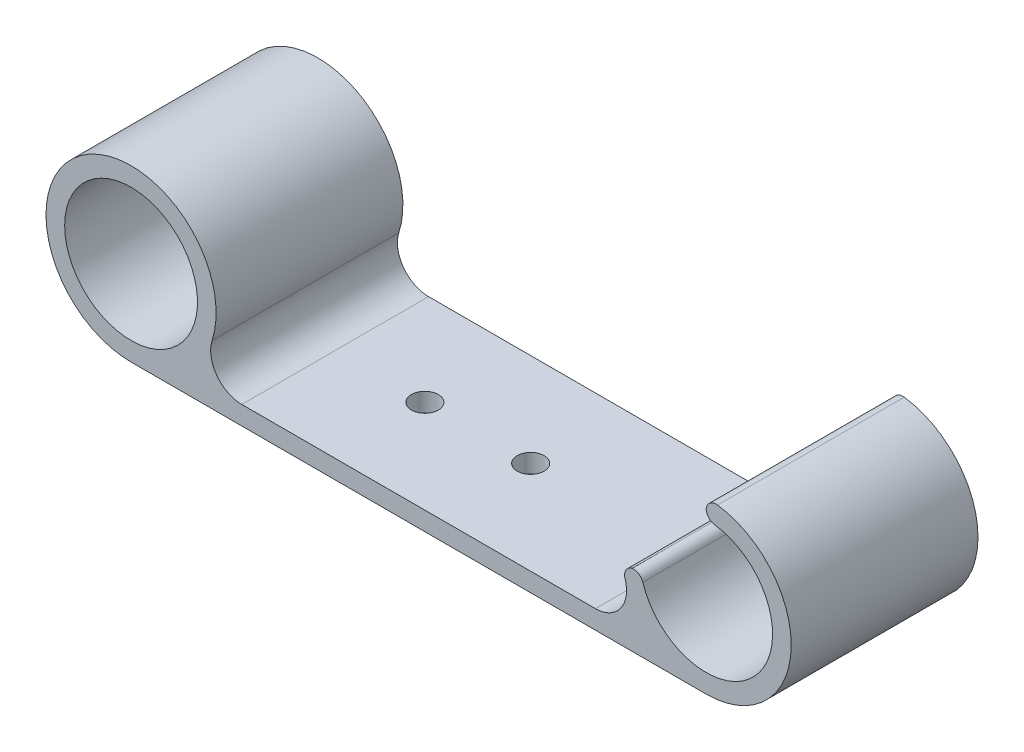
ISO-10303-21;
HEADER;
FILE_DESCRIPTION(('STEP AP214'),'2;1');
FILE_NAME('part.step','',(''),(''),'','','');
FILE_SCHEMA(('AUTOMOTIVE_DESIGN { 1 0 10303 214 1 1 1 1 }'));
ENDSEC;
DATA;
#1=APPLICATION_CONTEXT('core data for automotive mechanical design processes');
#2=APPLICATION_PROTOCOL_DEFINITION('international standard','automotive_design',2000,#1);
#3=PRODUCT_CONTEXT('',#1,'mechanical');
#4=PRODUCT('Part','Part','',(#3));
#5=PRODUCT_RELATED_PRODUCT_CATEGORY('part','',(#4));
#6=PRODUCT_DEFINITION_FORMATION('','',#4);
#7=PRODUCT_DEFINITION_CONTEXT('part definition',#1,'design');
#8=PRODUCT_DEFINITION('design','',#6,#7);
#9=PRODUCT_DEFINITION_SHAPE('','',#8);
#10=(LENGTH_UNIT() NAMED_UNIT(*) SI_UNIT(.MILLI.,.METRE.));
#11=(NAMED_UNIT(*) PLANE_ANGLE_UNIT() SI_UNIT($,.RADIAN.));
#12=(NAMED_UNIT(*) SI_UNIT($,.STERADIAN.) SOLID_ANGLE_UNIT());
#13=UNCERTAINTY_MEASURE_WITH_UNIT(LENGTH_MEASURE(1.E-05),#10,'distance_accuracy_value','');
#14=(GEOMETRIC_REPRESENTATION_CONTEXT(3) GLOBAL_UNCERTAINTY_ASSIGNED_CONTEXT((#13)) GLOBAL_UNIT_ASSIGNED_CONTEXT((#10,
#11,#12)) REPRESENTATION_CONTEXT('',''));
#15=CARTESIAN_POINT('',(0.,0.,0.));
#16=DIRECTION('',(0.,0.,1.));
#17=DIRECTION('',(1.,0.,0.));
#18=AXIS2_PLACEMENT_3D('',#15,#16,#17);
#19=CARTESIAN_POINT('',(58.658787305,17.3553125,19.05));
#20=DIRECTION('',(0.,0.,-1.));
#21=DIRECTION('',(-1.,0.,0.));
#22=AXIS2_PLACEMENT_3D('',#19,#20,#21);
#23=CYLINDRICAL_SURFACE('',#22,17.3553125);
#24=CARTESIAN_POINT('',(58.658787305,17.3553125,-19.05));
#25=DIRECTION('',(0.,0.,1.));
#26=DIRECTION('',(1.,0.,0.));
#27=AXIS2_PLACEMENT_3D('',#24,#25,#26);
#28=CIRCLE('',#27,17.3553125);
#29=CARTESIAN_POINT('',(60.9602475799895,34.5573516981678,-19.05));
#30=VERTEX_POINT('',#29);
#31=CARTESIAN_POINT('',(58.658787305,0.,-19.05));
#32=VERTEX_POINT('',#31);
#33=EDGE_CURVE('E264',#30,#32,#28,.F.);
#34=ORIENTED_EDGE('',*,*,#33,.F.);
#35=DIRECTION('',(0.,0.,-1.));
#36=VECTOR('',#35,1.);
#37=CARTESIAN_POINT('',(60.9602475799895,34.5573516981678,19.05));
#38=LINE('',#37,#36);
#39=CARTESIAN_POINT('',(60.9602475799895,34.5573516981678,19.05));
#40=VERTEX_POINT('',#39);
#41=EDGE_CURVE('E192',#30,#40,#38,.F.);
#42=ORIENTED_EDGE('',*,*,#41,.T.);
#43=CARTESIAN_POINT('',(58.658787305,17.3553125,19.05));
#44=DIRECTION('',(0.,0.,1.));
#45=DIRECTION('',(1.,0.,0.));
#46=AXIS2_PLACEMENT_3D('',#43,#44,#45);
#47=CIRCLE('',#46,17.3553125);
#48=CARTESIAN_POINT('',(58.658787305,0.,19.05));
#49=VERTEX_POINT('',#48);
#50=EDGE_CURVE('E160',#40,#49,#47,.F.);
#51=ORIENTED_EDGE('',*,*,#50,.T.);
#52=DIRECTION('',(0.,0.,-1.));
#53=VECTOR('',#52,1.);
#54=CARTESIAN_POINT('',(58.658787305,0.,19.05));
#55=LINE('',#54,#53);
#56=EDGE_CURVE('E144',#49,#32,#55,.T.);
#57=ORIENTED_EDGE('',*,*,#56,.T.);
#58=EDGE_LOOP('',(#34,#42,#51,#57));
#59=FACE_BOUND('',#58,.T.);
#60=ADVANCED_FACE('F45',(#59),#23,.T.);
#61=CARTESIAN_POINT('',(58.658787305,17.3553125,19.05));
#62=DIRECTION('',(0.,0.,-1.));
#63=DIRECTION('',(-1.,0.,0.));
#64=AXIS2_PLACEMENT_3D('',#61,#62,#63);
#65=CYLINDRICAL_SURFACE('',#64,13.5453125);
#66=CARTESIAN_POINT('',(58.658787305,17.3553125,19.05));
#67=DIRECTION('',(0.,0.,1.));
#68=DIRECTION('',(1.,0.,0.));
#69=AXIS2_PLACEMENT_3D('',#66,#67,#68);
#70=CIRCLE('',#69,13.5453125);
#71=CARTESIAN_POINT('',(45.7400642600769,13.2832017928568,19.05));
#72=VERTEX_POINT('',#71);
#73=CARTESIAN_POINT('',(60.425720785984,30.7848857172111,19.05));
#74=VERTEX_POINT('',#73);
#75=EDGE_CURVE('E244',#72,#74,#70,.T.);
#76=ORIENTED_EDGE('',*,*,#75,.T.);
#77=DIRECTION('',(0.,0.,-1.));
#78=VECTOR('',#77,1.);
#79=CARTESIAN_POINT('',(60.425720785984,30.7848857172111,19.05));
#80=LINE('',#79,#78);
#81=CARTESIAN_POINT('',(60.425720785984,30.7848857172111,-19.05));
#82=VERTEX_POINT('',#81);
#83=EDGE_CURVE('E55',#74,#82,#80,.T.);
#84=ORIENTED_EDGE('',*,*,#83,.T.);
#85=CARTESIAN_POINT('',(58.658787305,17.3553125,-19.05));
#86=DIRECTION('',(0.,0.,1.));
#87=DIRECTION('',(1.,0.,0.));
#88=AXIS2_PLACEMENT_3D('',#85,#86,#87);
#89=CIRCLE('',#88,13.5453125);
#90=CARTESIAN_POINT('',(45.7400642600769,13.2832017928568,-19.05));
#91=VERTEX_POINT('',#90);
#92=EDGE_CURVE('E267',#91,#82,#89,.T.);
#93=ORIENTED_EDGE('',*,*,#92,.F.);
#94=DIRECTION('',(0.,0.,-1.));
#95=VECTOR('',#94,1.);
#96=CARTESIAN_POINT('',(45.7400642600769,13.2832017928568,19.05));
#97=LINE('',#96,#95);
#98=EDGE_CURVE('E206',#91,#72,#97,.F.);
#99=ORIENTED_EDGE('',*,*,#98,.T.);
#100=EDGE_LOOP('',(#76,#84,#93,#99));
#101=FACE_BOUND('',#100,.T.);
#102=ADVANCED_FACE('F316',(#101),#65,.F.);
#103=CARTESIAN_POINT('',(58.658787305,17.3553125,19.05));
#104=DIRECTION('',(0.,0.,-1.));
#105=DIRECTION('',(-1.,0.,0.));
#106=AXIS2_PLACEMENT_3D('',#103,#104,#105);
#107=CYLINDRICAL_SURFACE('',#106,17.3553125);
#108=CARTESIAN_POINT('',(58.658787305,17.3553125,19.05));
#109=DIRECTION('',(0.,0.,1.));
#110=DIRECTION('',(1.,0.,0.));
#111=AXIS2_PLACEMENT_3D('',#108,#109,#110);
#112=CIRCLE('',#111,17.3553125);
#113=CARTESIAN_POINT('',(42.1222748785896,12.0874259461882,19.05));
#114=VERTEX_POINT('',#113);
#115=CARTESIAN_POINT('',(42.1177301177492,12.1017138190237,19.05));
#116=VERTEX_POINT('',#115);
#117=EDGE_CURVE('E248',#114,#116,#112,.F.);
#118=ORIENTED_EDGE('',*,*,#117,.T.);
#119=DIRECTION('',(0.,0.,-1.));
#120=VECTOR('',#119,1.);
#121=CARTESIAN_POINT('',(42.1177301177492,12.1017138190237,19.05));
#122=LINE('',#121,#120);
#123=CARTESIAN_POINT('',(42.1177301177492,12.1017138190237,-19.05));
#124=VERTEX_POINT('',#123);
#125=EDGE_CURVE('E11',#116,#124,#122,.T.);
#126=ORIENTED_EDGE('',*,*,#125,.T.);
#127=CARTESIAN_POINT('',(58.658787305,17.3553125,-19.05));
#128=DIRECTION('',(0.,0.,1.));
#129=DIRECTION('',(1.,0.,0.));
#130=AXIS2_PLACEMENT_3D('',#127,#128,#129);
#131=CIRCLE('',#130,17.3553125);
#132=CARTESIAN_POINT('',(42.1222748785896,12.0874259461882,-19.05));
#133=VERTEX_POINT('',#132);
#134=EDGE_CURVE('E271',#133,#124,#131,.F.);
#135=ORIENTED_EDGE('',*,*,#134,.F.);
#136=DIRECTION('',(0.,0.,-1.));
#137=VECTOR('',#136,1.);
#138=CARTESIAN_POINT('',(42.1222748785896,12.0874259461882,19.05));
#139=LINE('',#138,#137);
#140=EDGE_CURVE('E171',#114,#133,#139,.T.);
#141=ORIENTED_EDGE('',*,*,#140,.F.);
#142=EDGE_LOOP('',(#118,#126,#135,#141));
#143=FACE_BOUND('',#142,.T.);
#144=ADVANCED_FACE('F299',(#143),#107,.T.);
#145=CARTESIAN_POINT('',(36.0718592546874,10.16,19.05));
#146=DIRECTION('',(0.,0.,-1.));
#147=DIRECTION('',(-1.,0.,0.));
#148=AXIS2_PLACEMENT_3D('',#145,#146,#147);
#149=CYLINDRICAL_SURFACE('',#148,6.35);
#150=CARTESIAN_POINT('',(36.0718592546874,10.16,-19.05));
#151=DIRECTION('',(0.,0.,1.));
#152=DIRECTION('',(1.,0.,0.));
#153=AXIS2_PLACEMENT_3D('',#150,#151,#152);
#154=CIRCLE('',#153,6.35);
#155=CARTESIAN_POINT('',(36.0718592546874,3.81,-19.05));
#156=VERTEX_POINT('',#155);
#157=EDGE_CURVE('E275',#156,#133,#154,.T.);
#158=ORIENTED_EDGE('',*,*,#157,.F.);
#159=DIRECTION('',(0.,0.,-1.));
#160=VECTOR('',#159,1.);
#161=CARTESIAN_POINT('',(36.0718592546874,3.81,19.05));
#162=LINE('',#161,#160);
#163=CARTESIAN_POINT('',(36.0718592546874,3.81,19.05));
#164=VERTEX_POINT('',#163);
#165=EDGE_CURVE('E287',#164,#156,#162,.T.);
#166=ORIENTED_EDGE('',*,*,#165,.F.);
#167=CARTESIAN_POINT('',(36.0718592546874,10.16,19.05));
#168=DIRECTION('',(0.,0.,1.));
#169=DIRECTION('',(1.,0.,0.));
#170=AXIS2_PLACEMENT_3D('',#167,#168,#169);
#171=CIRCLE('',#170,6.35);
#172=EDGE_CURVE('E252',#164,#114,#171,.T.);
#173=ORIENTED_EDGE('',*,*,#172,.T.);
#174=ORIENTED_EDGE('',*,*,#140,.T.);
#175=EDGE_LOOP('',(#158,#166,#173,#174));
#176=FACE_BOUND('',#175,.T.);
#177=ADVANCED_FACE('F294',(#176),#149,.F.);
#178=CARTESIAN_POINT('',(0.,3.81,0.));
#179=DIRECTION('',(0.,-1.,0.));
#180=DIRECTION('',(0.,0.,-1.));
#181=AXIS2_PLACEMENT_3D('',#178,#179,#180);
#182=PLANE('',#181);
#183=CARTESIAN_POINT('',(-17.78,3.81,0.));
#184=DIRECTION('',(0.,1.,0.));
#185=DIRECTION('',(0.,0.,1.));
#186=AXIS2_PLACEMENT_3D('',#183,#184,#185);
#187=CIRCLE('',#186,2.749999961);
#188=CARTESIAN_POINT('',(-17.78,3.81,2.749999961));
#189=VERTEX_POINT('',#188);
#190=EDGE_CURVE('E223',#189,#189,#187,.T.);
#191=ORIENTED_EDGE('',*,*,#190,.F.);
#192=EDGE_LOOP('',(#191));
#193=FACE_BOUND('',#192,.T.);
#194=CARTESIAN_POINT('',(3.81,3.81,0.));
#195=DIRECTION('',(0.,1.,0.));
#196=DIRECTION('',(0.,0.,1.));
#197=AXIS2_PLACEMENT_3D('',#194,#195,#196);
#198=CIRCLE('',#197,2.749999961);
#199=CARTESIAN_POINT('',(3.81,3.81,2.749999961));
#200=VERTEX_POINT('',#199);
#201=EDGE_CURVE('E230',#200,#200,#198,.T.);
#202=ORIENTED_EDGE('',*,*,#201,.F.);
#203=EDGE_LOOP('',(#202));
#204=FACE_BOUND('',#203,.T.);
#205=ORIENTED_EDGE('',*,*,#165,.T.);
#206=DIRECTION('',(-1.,0.,0.));
#207=VECTOR('',#206,1.);
#208=CARTESIAN_POINT('',(-57.15,3.81,-19.05));
#209=LINE('',#208,#207);
#210=CARTESIAN_POINT('',(-36.0718592546874,3.81,-19.05));
#211=VERTEX_POINT('',#210);
#212=EDGE_CURVE('E146',#156,#211,#209,.T.);
#213=ORIENTED_EDGE('',*,*,#212,.T.);
#214=DIRECTION('',(0.,0.,-1.));
#215=VECTOR('',#214,1.);
#216=CARTESIAN_POINT('',(-36.0718592546874,3.81,19.05));
#217=LINE('',#216,#215);
#218=CARTESIAN_POINT('',(-36.0718592546874,3.81,19.05));
#219=VERTEX_POINT('',#218);
#220=EDGE_CURVE('E283',#219,#211,#217,.T.);
#221=ORIENTED_EDGE('',*,*,#220,.F.);
#222=DIRECTION('',(1.,0.,0.));
#223=VECTOR('',#222,1.);
#224=CARTESIAN_POINT('',(-57.15,3.81,19.05));
#225=LINE('',#224,#223);
#226=EDGE_CURVE('E177',#219,#164,#225,.T.);
#227=ORIENTED_EDGE('',*,*,#226,.T.);
#228=EDGE_LOOP('',(#205,#213,#221,#227));
#229=FACE_BOUND('',#228,.T.);
#230=ADVANCED_FACE('F307',(#193,#204,#229),#182,.F.);
#231=CARTESIAN_POINT('',(-57.15,3.81,-19.05));
#232=DIRECTION('',(0.,0.,1.));
#233=DIRECTION('',(1.,0.,0.));
#234=AXIS2_PLACEMENT_3D('',#231,#232,#233);
#235=PLANE('',#234);
#236=CARTESIAN_POINT('',(60.690787305,32.7995230891708,-19.05));
#237=DIRECTION('',(0.,0.,1.));
#238=DIRECTION('',(1.,0.,0.));
#239=AXIS2_PLACEMENT_3D('',#236,#237,#238);
#240=CIRCLE('',#239,2.032);
#241=CARTESIAN_POINT('',(58.6628299373703,32.6714101894436,-19.05));
#242=VERTEX_POINT('',#241);
#243=EDGE_CURVE('E186',#82,#242,#240,.F.);
#244=ORIENTED_EDGE('',*,*,#243,.T.);
#245=CARTESIAN_POINT('',(60.690787305,32.5432972897164,-19.05));
#246=DIRECTION('',(0.,0.,1.));
#247=DIRECTION('',(1.,0.,0.));
#248=AXIS2_PLACEMENT_3D('',#245,#246,#247);
#249=CIRCLE('',#248,2.032);
#250=EDGE_CURVE('E189',#242,#30,#249,.F.);
#251=ORIENTED_EDGE('',*,*,#250,.T.);
#252=ORIENTED_EDGE('',*,*,#33,.T.);
#253=DIRECTION('',(-1.,0.,0.));
#254=VECTOR('',#253,1.);
#255=CARTESIAN_POINT('',(-57.15,0.,-19.05));
#256=LINE('',#255,#254);
#257=CARTESIAN_POINT('',(-58.658787305,0.,-19.05));
#258=VERTEX_POINT('',#257);
#259=EDGE_CURVE('E147',#32,#258,#256,.T.);
#260=ORIENTED_EDGE('',*,*,#259,.T.);
#261=CARTESIAN_POINT('',(-58.658787305,17.3553125,-19.05));
#262=DIRECTION('',(0.,0.,1.));
#263=DIRECTION('',(1.,0.,0.));
#264=AXIS2_PLACEMENT_3D('',#261,#262,#263);
#265=CIRCLE('',#264,17.3553125);
#266=CARTESIAN_POINT('',(-42.1222748785896,12.0874259461882,-19.05));
#267=VERTEX_POINT('',#266);
#268=EDGE_CURVE('E165',#267,#258,#265,.T.);
#269=ORIENTED_EDGE('',*,*,#268,.F.);
#270=CARTESIAN_POINT('',(-36.0718592546874,10.16,-19.05));
#271=DIRECTION('',(0.,0.,1.));
#272=DIRECTION('',(1.,0.,0.));
#273=AXIS2_PLACEMENT_3D('',#270,#271,#272);
#274=CIRCLE('',#273,6.35);
#275=EDGE_CURVE('E240',#211,#267,#274,.F.);
#276=ORIENTED_EDGE('',*,*,#275,.F.);
#277=ORIENTED_EDGE('',*,*,#212,.F.);
#278=ORIENTED_EDGE('',*,*,#157,.T.);
#279=ORIENTED_EDGE('',*,*,#134,.T.);
#280=CARTESIAN_POINT('',(44.054395228475,12.7168172647118,-19.05));
#281=DIRECTION('',(0.,0.,1.));
#282=DIRECTION('',(1.,0.,0.));
#283=AXIS2_PLACEMENT_3D('',#280,#281,#282);
#284=CIRCLE('',#283,2.032);
#285=CARTESIAN_POINT('',(43.5760775502877,14.6917188315585,-19.05));
#286=VERTEX_POINT('',#285);
#287=EDGE_CURVE('E179',#124,#286,#284,.F.);
#288=ORIENTED_EDGE('',*,*,#287,.T.);
#289=CARTESIAN_POINT('',(43.8020620746505,12.6723241215653,-19.05));
#290=DIRECTION('',(0.,0.,1.));
#291=DIRECTION('',(1.,0.,0.));
#292=AXIS2_PLACEMENT_3D('',#289,#290,#291);
#293=CIRCLE('',#292,2.032);
#294=EDGE_CURVE('E183',#286,#91,#293,.F.);
#295=ORIENTED_EDGE('',*,*,#294,.T.);
#296=ORIENTED_EDGE('',*,*,#92,.T.);
#297=EDGE_LOOP('',(#244,#251,#252,#260,#269,#276,#277,#278,#279,#288,#295,#296));
#298=FACE_BOUND('',#297,.T.);
#299=CARTESIAN_POINT('',(-58.658787305,17.3553125,-19.05));
#300=DIRECTION('',(0.,0.,1.));
#301=DIRECTION('',(1.,0.,0.));
#302=AXIS2_PLACEMENT_3D('',#299,#300,#301);
#303=CIRCLE('',#302,13.5453125);
#304=CARTESIAN_POINT('',(-72.204099805,17.3553125,-19.05));
#305=VERTEX_POINT('',#304);
#306=EDGE_CURVE('E216',#305,#305,#303,.T.);
#307=ORIENTED_EDGE('',*,*,#306,.T.);
#308=EDGE_LOOP('',(#307));
#309=FACE_BOUND('',#308,.T.);
#310=ADVANCED_FACE('F303',(#298,#309),#235,.F.);
#311=CARTESIAN_POINT('',(-57.15,3.81,19.05));
#312=DIRECTION('',(0.,0.,-1.));
#313=DIRECTION('',(-1.,0.,0.));
#314=AXIS2_PLACEMENT_3D('',#311,#312,#313);
#315=PLANE('',#314);
#316=ORIENTED_EDGE('',*,*,#50,.F.);
#317=CARTESIAN_POINT('',(60.690787305,32.5432972897164,19.05));
#318=DIRECTION('',(0.,0.,-1.));
#319=DIRECTION('',(-1.,0.,0.));
#320=AXIS2_PLACEMENT_3D('',#317,#318,#319);
#321=CIRCLE('',#320,2.032);
#322=CARTESIAN_POINT('',(58.6628299373703,32.6714101894436,19.05));
#323=VERTEX_POINT('',#322);
#324=EDGE_CURVE('E63',#40,#323,#321,.F.);
#325=ORIENTED_EDGE('',*,*,#324,.T.);
#326=CARTESIAN_POINT('',(60.690787305,32.7995230891708,19.05));
#327=DIRECTION('',(0.,0.,-1.));
#328=DIRECTION('',(-1.,0.,0.));
#329=AXIS2_PLACEMENT_3D('',#326,#327,#328);
#330=CIRCLE('',#329,2.032);
#331=EDGE_CURVE('E201',#323,#74,#330,.F.);
#332=ORIENTED_EDGE('',*,*,#331,.T.);
#333=ORIENTED_EDGE('',*,*,#75,.F.);
#334=CARTESIAN_POINT('',(43.8020620746505,12.6723241215653,19.05));
#335=DIRECTION('',(0.,0.,-1.));
#336=DIRECTION('',(-1.,0.,0.));
#337=AXIS2_PLACEMENT_3D('',#334,#335,#336);
#338=CIRCLE('',#337,2.032);
#339=CARTESIAN_POINT('',(43.5760775502877,14.6917188315585,19.05));
#340=VERTEX_POINT('',#339);
#341=EDGE_CURVE('E70',#72,#340,#338,.F.);
#342=ORIENTED_EDGE('',*,*,#341,.T.);
#343=CARTESIAN_POINT('',(44.054395228475,12.7168172647118,19.05));
#344=DIRECTION('',(0.,0.,-1.));
#345=DIRECTION('',(-1.,0.,0.));
#346=AXIS2_PLACEMENT_3D('',#343,#344,#345);
#347=CIRCLE('',#346,2.032);
#348=EDGE_CURVE('E196',#340,#116,#347,.F.);
#349=ORIENTED_EDGE('',*,*,#348,.T.);
#350=ORIENTED_EDGE('',*,*,#117,.F.);
#351=ORIENTED_EDGE('',*,*,#172,.F.);
#352=ORIENTED_EDGE('',*,*,#226,.F.);
#353=CARTESIAN_POINT('',(-36.0718592546874,10.16,19.05));
#354=DIRECTION('',(0.,0.,1.));
#355=DIRECTION('',(1.,0.,0.));
#356=AXIS2_PLACEMENT_3D('',#353,#354,#355);
#357=CIRCLE('',#356,6.35);
#358=CARTESIAN_POINT('',(-42.1222748785896,12.0874259461882,19.05));
#359=VERTEX_POINT('',#358);
#360=EDGE_CURVE('E155',#219,#359,#357,.F.);
#361=ORIENTED_EDGE('',*,*,#360,.T.);
#362=CARTESIAN_POINT('',(-58.658787305,17.3553125,19.05));
#363=DIRECTION('',(0.,0.,1.));
#364=DIRECTION('',(1.,0.,0.));
#365=AXIS2_PLACEMENT_3D('',#362,#363,#364);
#366=CIRCLE('',#365,17.3553125);
#367=CARTESIAN_POINT('',(-58.658787305,0.,19.05));
#368=VERTEX_POINT('',#367);
#369=EDGE_CURVE('E150',#359,#368,#366,.T.);
#370=ORIENTED_EDGE('',*,*,#369,.T.);
#371=DIRECTION('',(1.,0.,0.));
#372=VECTOR('',#371,1.);
#373=CARTESIAN_POINT('',(-57.15,0.,19.05));
#374=LINE('',#373,#372);
#375=EDGE_CURVE('E136',#368,#49,#374,.T.);
#376=ORIENTED_EDGE('',*,*,#375,.T.);
#377=EDGE_LOOP('',(#316,#325,#332,#333,#342,#349,#350,#351,#352,#361,#370,#376));
#378=FACE_BOUND('',#377,.T.);
#379=CARTESIAN_POINT('',(-58.658787305,17.3553125,19.05));
#380=DIRECTION('',(0.,0.,1.));
#381=DIRECTION('',(1.,0.,0.));
#382=AXIS2_PLACEMENT_3D('',#379,#380,#381);
#383=CIRCLE('',#382,13.5453125);
#384=CARTESIAN_POINT('',(-72.204099805,17.3553125,19.05));
#385=VERTEX_POINT('',#384);
#386=EDGE_CURVE('E161',#385,#385,#383,.T.);
#387=ORIENTED_EDGE('',*,*,#386,.F.);
#388=EDGE_LOOP('',(#387));
#389=FACE_BOUND('',#388,.T.);
#390=ADVANCED_FACE('F151',(#378,#389),#315,.F.);
#391=CARTESIAN_POINT('',(0.,0.,0.));
#392=DIRECTION('',(0.,-1.,0.));
#393=DIRECTION('',(0.,0.,-1.));
#394=AXIS2_PLACEMENT_3D('',#391,#392,#393);
#395=PLANE('',#394);
#396=CARTESIAN_POINT('',(-17.78,0.,0.));
#397=DIRECTION('',(0.,-1.,0.));
#398=DIRECTION('',(0.,0.,-1.));
#399=AXIS2_PLACEMENT_3D('',#396,#397,#398);
#400=CIRCLE('',#399,2.749999961);
#401=CARTESIAN_POINT('',(-17.78,0.,2.749999961));
#402=VERTEX_POINT('',#401);
#403=EDGE_CURVE('E49',#402,#402,#400,.T.);
#404=ORIENTED_EDGE('',*,*,#403,.F.);
#405=EDGE_LOOP('',(#404));
#406=FACE_BOUND('',#405,.T.);
#407=CARTESIAN_POINT('',(3.81,0.,0.));
#408=DIRECTION('',(0.,-1.,0.));
#409=DIRECTION('',(0.,0.,-1.));
#410=AXIS2_PLACEMENT_3D('',#407,#408,#409);
#411=CIRCLE('',#410,2.749999961);
#412=CARTESIAN_POINT('',(3.81,0.,2.749999961));
#413=VERTEX_POINT('',#412);
#414=EDGE_CURVE('E220',#413,#413,#411,.T.);
#415=ORIENTED_EDGE('',*,*,#414,.F.);
#416=EDGE_LOOP('',(#415));
#417=FACE_BOUND('',#416,.T.);
#418=ORIENTED_EDGE('',*,*,#259,.F.);
#419=ORIENTED_EDGE('',*,*,#56,.F.);
#420=ORIENTED_EDGE('',*,*,#375,.F.);
#421=DIRECTION('',(0.,0.,-1.));
#422=VECTOR('',#421,1.);
#423=CARTESIAN_POINT('',(-58.658787305,0.,19.05));
#424=LINE('',#423,#422);
#425=EDGE_CURVE('E141',#368,#258,#424,.T.);
#426=ORIENTED_EDGE('',*,*,#425,.T.);
#427=EDGE_LOOP('',(#418,#419,#420,#426));
#428=FACE_BOUND('',#427,.T.);
#429=ADVANCED_FACE('F139',(#406,#417,#428),#395,.T.);
#430=CARTESIAN_POINT('',(-58.658787305,17.3553125,19.05));
#431=DIRECTION('',(0.,0.,-1.));
#432=DIRECTION('',(-1.,0.,0.));
#433=AXIS2_PLACEMENT_3D('',#430,#431,#432);
#434=CYLINDRICAL_SURFACE('',#433,17.3553125);
#435=ORIENTED_EDGE('',*,*,#268,.T.);
#436=ORIENTED_EDGE('',*,*,#425,.F.);
#437=ORIENTED_EDGE('',*,*,#369,.F.);
#438=DIRECTION('',(0.,0.,-1.));
#439=VECTOR('',#438,1.);
#440=CARTESIAN_POINT('',(-42.1222748785896,12.0874259461882,19.05));
#441=LINE('',#440,#439);
#442=EDGE_CURVE('E258',#359,#267,#441,.T.);
#443=ORIENTED_EDGE('',*,*,#442,.T.);
#444=EDGE_LOOP('',(#435,#436,#437,#443));
#445=FACE_BOUND('',#444,.T.);
#446=ADVANCED_FACE('F163',(#445),#434,.T.);
#447=CARTESIAN_POINT('',(-58.658787305,17.3553125,19.05));
#448=DIRECTION('',(0.,0.,-1.));
#449=DIRECTION('',(-1.,0.,0.));
#450=AXIS2_PLACEMENT_3D('',#447,#448,#449);
#451=CYLINDRICAL_SURFACE('',#450,13.5453125);
#452=CARTESIAN_POINT('',(-72.204099805,17.3553125,19.05));
#453=CARTESIAN_POINT('',(-72.204099805,17.3553125,18.653125));
#454=CARTESIAN_POINT('',(-72.204099805,17.3553125,18.25625));
#455=CARTESIAN_POINT('',(-72.204099805,17.3553125,17.4625));
#456=CARTESIAN_POINT('',(-72.204099805,17.3553125,17.065625));
#457=CARTESIAN_POINT('',(-72.204099805,17.3553125,16.271875));
#458=CARTESIAN_POINT('',(-72.204099805,17.3553125,15.875));
#459=CARTESIAN_POINT('',(-72.204099805,17.3553125,15.08125));
#460=CARTESIAN_POINT('',(-72.204099805,17.3553125,14.684375));
#461=CARTESIAN_POINT('',(-72.204099805,17.3553125,13.890625));
#462=CARTESIAN_POINT('',(-72.204099805,17.3553125,13.49375));
#463=CARTESIAN_POINT('',(-72.204099805,17.3553125,12.7));
#464=CARTESIAN_POINT('',(-72.204099805,17.3553125,12.303125));
#465=CARTESIAN_POINT('',(-72.204099805,17.3553125,11.509375));
#466=CARTESIAN_POINT('',(-72.204099805,17.3553125,11.1125));
#467=CARTESIAN_POINT('',(-72.204099805,17.3553125,10.31875));
#468=CARTESIAN_POINT('',(-72.204099805,17.3553125,9.921875));
#469=CARTESIAN_POINT('',(-72.204099805,17.3553125,9.128125));
#470=CARTESIAN_POINT('',(-72.204099805,17.3553125,8.73125));
#471=CARTESIAN_POINT('',(-72.204099805,17.3553125,7.9375));
#472=CARTESIAN_POINT('',(-72.204099805,17.3553125,7.540625));
#473=CARTESIAN_POINT('',(-72.204099805,17.3553125,6.746875));
#474=CARTESIAN_POINT('',(-72.204099805,17.3553125,6.35));
#475=CARTESIAN_POINT('',(-72.204099805,17.3553125,5.55625));
#476=CARTESIAN_POINT('',(-72.204099805,17.3553125,5.159375));
#477=CARTESIAN_POINT('',(-72.204099805,17.3553125,4.365625));
#478=CARTESIAN_POINT('',(-72.204099805,17.3553125,3.96875));
#479=CARTESIAN_POINT('',(-72.204099805,17.3553125,3.175));
#480=CARTESIAN_POINT('',(-72.204099805,17.3553125,2.778125));
#481=CARTESIAN_POINT('',(-72.204099805,17.3553125,1.984375));
#482=CARTESIAN_POINT('',(-72.204099805,17.3553125,1.5875));
#483=CARTESIAN_POINT('',(-72.204099805,17.3553125,0.793749999999997));
#484=CARTESIAN_POINT('',(-72.204099805,17.3553125,0.396874999999997));
#485=CARTESIAN_POINT('',(-72.204099805,17.3553125,-0.396875000000004));
#486=CARTESIAN_POINT('',(-72.204099805,17.3553125,-0.793750000000004));
#487=CARTESIAN_POINT('',(-72.204099805,17.3553125,-1.5875));
#488=CARTESIAN_POINT('',(-72.204099805,17.3553125,-1.984375));
#489=CARTESIAN_POINT('',(-72.204099805,17.3553125,-2.77812500000001));
#490=CARTESIAN_POINT('',(-72.204099805,17.3553125,-3.17500000000001));
#491=CARTESIAN_POINT('',(-72.204099805,17.3553125,-3.96875000000001));
#492=CARTESIAN_POINT('',(-72.204099805,17.3553125,-4.36562500000001));
#493=CARTESIAN_POINT('',(-72.204099805,17.3553125,-5.15937500000001));
#494=CARTESIAN_POINT('',(-72.204099805,17.3553125,-5.55625));
#495=CARTESIAN_POINT('',(-72.204099805,17.3553125,-6.35));
#496=CARTESIAN_POINT('',(-72.204099805,17.3553125,-6.746875));
#497=CARTESIAN_POINT('',(-72.204099805,17.3553125,-7.540625));
#498=CARTESIAN_POINT('',(-72.204099805,17.3553125,-7.93750000000001));
#499=CARTESIAN_POINT('',(-72.204099805,17.3553125,-8.73125));
#500=CARTESIAN_POINT('',(-72.204099805,17.3553125,-9.12812500000001));
#501=CARTESIAN_POINT('',(-72.204099805,17.3553125,-9.92187500000001));
#502=CARTESIAN_POINT('',(-72.204099805,17.3553125,-10.31875));
#503=CARTESIAN_POINT('',(-72.204099805,17.3553125,-11.1125));
#504=CARTESIAN_POINT('',(-72.204099805,17.3553125,-11.509375));
#505=CARTESIAN_POINT('',(-72.204099805,17.3553125,-12.303125));
#506=CARTESIAN_POINT('',(-72.204099805,17.3553125,-12.7));
#507=CARTESIAN_POINT('',(-72.204099805,17.3553125,-13.49375));
#508=CARTESIAN_POINT('',(-72.204099805,17.3553125,-13.890625));
#509=CARTESIAN_POINT('',(-72.204099805,17.3553125,-14.684375));
#510=CARTESIAN_POINT('',(-72.204099805,17.3553125,-15.08125));
#511=CARTESIAN_POINT('',(-72.204099805,17.3553125,-15.875));
#512=CARTESIAN_POINT('',(-72.204099805,17.3553125,-16.271875));
#513=CARTESIAN_POINT('',(-72.204099805,17.3553125,-17.065625));
#514=CARTESIAN_POINT('',(-72.204099805,17.3553125,-17.4625));
#515=CARTESIAN_POINT('',(-72.204099805,17.3553125,-18.25625));
#516=CARTESIAN_POINT('',(-72.204099805,17.3553125,-18.653125));
#517=CARTESIAN_POINT('',(-72.204099805,17.3553125,-19.05));
#518=B_SPLINE_CURVE_WITH_KNOTS('',3,(#452,#453,#454,#455,#456,#457,#458,#459,#460,#461,#462,
#463,#464,#465,#466,#467,#468,#469,#470,#471,#472,#473,#474,#475,#476,#477,#478,#479,#480,#481,
#482,#483,#484,#485,#486,#487,#488,#489,#490,#491,#492,#493,#494,#495,#496,#497,#498,#499,#500,
#501,#502,#503,#504,#505,#506,#507,#508,#509,#510,#511,#512,#513,#514,#515,#516,#517),
.UNSPECIFIED.,.F.,.F.,(4,2,2,2,2,2,2,2,2,2,2,2,2,2,2,2,2,2,2,2,2,2,2,2,2,2,2,2,2,2,2,2,4),(0.,
1.190625,2.38125,3.571875,4.7625,5.953125,7.14375,8.334375,9.525,10.715625,11.90625,13.096875,
14.2875,15.478125,16.66875,17.859375,19.05,20.240625,21.43125,22.621875,23.8125,25.003125,
26.19375,27.384375,28.575,29.765625,30.95625,32.146875,33.3375,34.528125,35.71875,36.909375,
38.1),.UNSPECIFIED.);
#519=EDGE_CURVE('BSEAM341',#385,#305,#518,.T.);
#520=ORIENTED_EDGE('',*,*,#386,.T.);
#521=ORIENTED_EDGE('',*,*,#306,.F.);
#522=ORIENTED_EDGE('',*,*,#519,.T.);
#523=ORIENTED_EDGE('',*,*,#519,.F.);
#524=EDGE_LOOP('',(#520,#522,#521,#523));
#525=FACE_BOUND('',#524,.T.);
#526=ADVANCED_FACE('F341',(#525),#451,.F.);
#527=CARTESIAN_POINT('',(-36.0718592546874,10.16,19.05));
#528=DIRECTION('',(0.,0.,-1.));
#529=DIRECTION('',(-1.,0.,0.));
#530=AXIS2_PLACEMENT_3D('',#527,#528,#529);
#531=CYLINDRICAL_SURFACE('',#530,6.35);
#532=ORIENTED_EDGE('',*,*,#275,.T.);
#533=ORIENTED_EDGE('',*,*,#442,.F.);
#534=ORIENTED_EDGE('',*,*,#360,.F.);
#535=ORIENTED_EDGE('',*,*,#220,.T.);
#536=EDGE_LOOP('',(#532,#533,#534,#535));
#537=FACE_BOUND('',#536,.T.);
#538=ADVANCED_FACE('F344',(#537),#531,.F.);
#539=CARTESIAN_POINT('',(60.690787305,32.7995230891708,19.05));
#540=DIRECTION('',(0.,0.,-1.));
#541=DIRECTION('',(-1.,0.,0.));
#542=AXIS2_PLACEMENT_3D('',#539,#540,#541);
#543=CYLINDRICAL_SURFACE('',#542,2.032);
#544=ORIENTED_EDGE('',*,*,#83,.F.);
#545=ORIENTED_EDGE('',*,*,#331,.F.);
#546=DIRECTION('',(0.,0.,-1.));
#547=VECTOR('',#546,1.);
#548=CARTESIAN_POINT('',(58.6628299373703,32.6714101894436,0.));
#549=LINE('',#548,#547);
#550=EDGE_CURVE('E212',#242,#323,#549,.F.);
#551=ORIENTED_EDGE('',*,*,#550,.F.);
#552=ORIENTED_EDGE('',*,*,#243,.F.);
#553=EDGE_LOOP('',(#544,#545,#551,#552));
#554=FACE_BOUND('',#553,.T.);
#555=ADVANCED_FACE('F357',(#554),#543,.T.);
#556=CARTESIAN_POINT('',(60.690787305,32.5432972897164,19.05));
#557=DIRECTION('',(0.,0.,-1.));
#558=DIRECTION('',(-1.,0.,0.));
#559=AXIS2_PLACEMENT_3D('',#556,#557,#558);
#560=CYLINDRICAL_SURFACE('',#559,2.032);
#561=ORIENTED_EDGE('',*,*,#324,.F.);
#562=ORIENTED_EDGE('',*,*,#41,.F.);
#563=ORIENTED_EDGE('',*,*,#250,.F.);
#564=ORIENTED_EDGE('',*,*,#550,.T.);
#565=EDGE_LOOP('',(#561,#562,#563,#564));
#566=FACE_BOUND('',#565,.T.);
#567=ADVANCED_FACE('F327',(#566),#560,.T.);
#568=CARTESIAN_POINT('',(44.054395228475,12.7168172647118,19.05));
#569=DIRECTION('',(0.,0.,-1.));
#570=DIRECTION('',(-1.,0.,0.));
#571=AXIS2_PLACEMENT_3D('',#568,#569,#570);
#572=CYLINDRICAL_SURFACE('',#571,2.032);
#573=ORIENTED_EDGE('',*,*,#125,.F.);
#574=ORIENTED_EDGE('',*,*,#348,.F.);
#575=DIRECTION('',(0.,0.,-1.));
#576=VECTOR('',#575,1.);
#577=CARTESIAN_POINT('',(43.5760775502877,14.6917188315585,0.));
#578=LINE('',#577,#576);
#579=EDGE_CURVE('E217',#286,#340,#578,.F.);
#580=ORIENTED_EDGE('',*,*,#579,.F.);
#581=ORIENTED_EDGE('',*,*,#287,.F.);
#582=EDGE_LOOP('',(#573,#574,#580,#581));
#583=FACE_BOUND('',#582,.T.);
#584=ADVANCED_FACE('F47',(#583),#572,.T.);
#585=CARTESIAN_POINT('',(43.8020620746505,12.6723241215653,19.05));
#586=DIRECTION('',(0.,0.,-1.));
#587=DIRECTION('',(-1.,0.,0.));
#588=AXIS2_PLACEMENT_3D('',#585,#586,#587);
#589=CYLINDRICAL_SURFACE('',#588,2.032);
#590=ORIENTED_EDGE('',*,*,#341,.F.);
#591=ORIENTED_EDGE('',*,*,#98,.F.);
#592=ORIENTED_EDGE('',*,*,#294,.F.);
#593=ORIENTED_EDGE('',*,*,#579,.T.);
#594=EDGE_LOOP('',(#590,#591,#592,#593));
#595=FACE_BOUND('',#594,.T.);
#596=ADVANCED_FACE('F318',(#595),#589,.T.);
#597=CARTESIAN_POINT('',(3.81,-8.89,0.));
#598=DIRECTION('',(0.,1.,0.));
#599=DIRECTION('',(0.,0.,1.));
#600=AXIS2_PLACEMENT_3D('',#597,#598,#599);
#601=CYLINDRICAL_SURFACE('',#600,2.749999961);
#602=CARTESIAN_POINT('',(3.81,0.,2.749999961));
#603=CARTESIAN_POINT('',(3.81,0.0396875000000016,2.749999961));
#604=CARTESIAN_POINT('',(3.81,0.0793750000000013,2.749999961));
#605=CARTESIAN_POINT('',(3.81,0.158750000000001,2.749999961));
#606=CARTESIAN_POINT('',(3.81,0.198437500000002,2.749999961));
#607=CARTESIAN_POINT('',(3.81,0.277812500000002,2.749999961));
#608=CARTESIAN_POINT('',(3.81,0.317500000000002,2.749999961));
#609=CARTESIAN_POINT('',(3.81,0.396875000000001,2.749999961));
#610=CARTESIAN_POINT('',(3.81,0.436562500000001,2.749999961));
#611=CARTESIAN_POINT('',(3.81,0.515937500000001,2.749999961));
#612=CARTESIAN_POINT('',(3.81,0.555625000000002,2.749999961));
#613=CARTESIAN_POINT('',(3.81,0.635000000000002,2.749999961));
#614=CARTESIAN_POINT('',(3.81,0.674687500000002,2.749999961));
#615=CARTESIAN_POINT('',(3.81,0.754062500000001,2.749999961));
#616=CARTESIAN_POINT('',(3.81,0.793750000000001,2.749999961));
#617=CARTESIAN_POINT('',(3.81,0.873125000000001,2.749999961));
#618=CARTESIAN_POINT('',(3.81,0.9128125,2.749999961));
#619=CARTESIAN_POINT('',(3.81,0.992187500000001,2.749999961));
#620=CARTESIAN_POINT('',(3.81,1.031875,2.749999961));
#621=CARTESIAN_POINT('',(3.81,1.11125,2.749999961));
#622=CARTESIAN_POINT('',(3.81,1.1509375,2.749999961));
#623=CARTESIAN_POINT('',(3.81,1.2303125,2.749999961));
#624=CARTESIAN_POINT('',(3.81,1.27,2.749999961));
#625=CARTESIAN_POINT('',(3.81,1.349375,2.749999961));
#626=CARTESIAN_POINT('',(3.81,1.3890625,2.749999961));
#627=CARTESIAN_POINT('',(3.81,1.4684375,2.749999961));
#628=CARTESIAN_POINT('',(3.81,1.508125,2.749999961));
#629=CARTESIAN_POINT('',(3.81,1.5875,2.749999961));
#630=CARTESIAN_POINT('',(3.81,1.6271875,2.749999961));
#631=CARTESIAN_POINT('',(3.81,1.7065625,2.749999961));
#632=CARTESIAN_POINT('',(3.81,1.74625,2.749999961));
#633=CARTESIAN_POINT('',(3.81,1.825625,2.749999961));
#634=CARTESIAN_POINT('',(3.81,1.8653125,2.749999961));
#635=CARTESIAN_POINT('',(3.81,1.9446875,2.749999961));
#636=CARTESIAN_POINT('',(3.81,1.984375,2.749999961));
#637=CARTESIAN_POINT('',(3.81,2.06375,2.749999961));
#638=CARTESIAN_POINT('',(3.81,2.1034375,2.749999961));
#639=CARTESIAN_POINT('',(3.81,2.1828125,2.749999961));
#640=CARTESIAN_POINT('',(3.81,2.2225,2.749999961));
#641=CARTESIAN_POINT('',(3.81,2.301875,2.749999961));
#642=CARTESIAN_POINT('',(3.81,2.3415625,2.749999961));
#643=CARTESIAN_POINT('',(3.81,2.4209375,2.749999961));
#644=CARTESIAN_POINT('',(3.81,2.460625,2.749999961));
#645=CARTESIAN_POINT('',(3.81,2.54,2.749999961));
#646=CARTESIAN_POINT('',(3.81,2.5796875,2.749999961));
#647=CARTESIAN_POINT('',(3.81,2.6590625,2.749999961));
#648=CARTESIAN_POINT('',(3.81,2.69875,2.749999961));
#649=CARTESIAN_POINT('',(3.81,2.778125,2.749999961));
#650=CARTESIAN_POINT('',(3.81,2.8178125,2.749999961));
#651=CARTESIAN_POINT('',(3.81,2.8971875,2.749999961));
#652=CARTESIAN_POINT('',(3.81,2.936875,2.749999961));
#653=CARTESIAN_POINT('',(3.81,3.01625,2.749999961));
#654=CARTESIAN_POINT('',(3.81,3.0559375,2.749999961));
#655=CARTESIAN_POINT('',(3.81,3.1353125,2.749999961));
#656=CARTESIAN_POINT('',(3.81,3.175,2.749999961));
#657=CARTESIAN_POINT('',(3.81,3.254375,2.749999961));
#658=CARTESIAN_POINT('',(3.81,3.2940625,2.749999961));
#659=CARTESIAN_POINT('',(3.81,3.3734375,2.749999961));
#660=CARTESIAN_POINT('',(3.81,3.413125,2.749999961));
#661=CARTESIAN_POINT('',(3.81,3.4925,2.749999961));
#662=CARTESIAN_POINT('',(3.81,3.5321875,2.749999961));
#663=CARTESIAN_POINT('',(3.81,3.6115625,2.749999961));
#664=CARTESIAN_POINT('',(3.81,3.65125,2.749999961));
#665=CARTESIAN_POINT('',(3.81,3.730625,2.749999961));
#666=CARTESIAN_POINT('',(3.81,3.7703125,2.749999961));
#667=CARTESIAN_POINT('',(3.81,3.81,2.749999961));
#668=B_SPLINE_CURVE_WITH_KNOTS('',3,(#602,#603,#604,#605,#606,#607,#608,#609,#610,#611,#612,
#613,#614,#615,#616,#617,#618,#619,#620,#621,#622,#623,#624,#625,#626,#627,#628,#629,#630,#631,
#632,#633,#634,#635,#636,#637,#638,#639,#640,#641,#642,#643,#644,#645,#646,#647,#648,#649,#650,
#651,#652,#653,#654,#655,#656,#657,#658,#659,#660,#661,#662,#663,#664,#665,#666,#667),
.UNSPECIFIED.,.F.,.F.,(4,2,2,2,2,2,2,2,2,2,2,2,2,2,2,2,2,2,2,2,2,2,2,2,2,2,2,2,2,2,2,2,4),(0.,
0.119062499999999,0.238125,0.3571875,0.476249999999999,0.5953125,0.714375,0.833437499999999,
0.952499999999998,1.0715625,1.190625,1.3096875,1.42875,1.5478125,1.666875,1.7859375,1.905,
2.0240625,2.143125,2.2621875,2.38125,2.5003125,2.619375,2.7384375,2.8575,2.9765625,3.095625,
3.2146875,3.33375,3.4528125,3.571875,3.6909375,3.81),.UNSPECIFIED.);
#669=EDGE_CURVE('BSEAM320',#413,#200,#668,.T.);
#670=ORIENTED_EDGE('',*,*,#414,.T.);
#671=ORIENTED_EDGE('',*,*,#201,.T.);
#672=ORIENTED_EDGE('',*,*,#669,.T.);
#673=ORIENTED_EDGE('',*,*,#669,.F.);
#674=EDGE_LOOP('',(#670,#672,#671,#673));
#675=FACE_BOUND('',#674,.T.);
#676=ADVANCED_FACE('F320',(#675),#601,.F.);
#677=CARTESIAN_POINT('',(-17.78,-8.89,0.));
#678=DIRECTION('',(0.,1.,0.));
#679=DIRECTION('',(0.,0.,1.));
#680=AXIS2_PLACEMENT_3D('',#677,#678,#679);
#681=CYLINDRICAL_SURFACE('',#680,2.749999961);
#682=CARTESIAN_POINT('',(-17.78,0.,2.749999961));
#683=CARTESIAN_POINT('',(-17.78,0.0396875000000016,2.749999961));
#684=CARTESIAN_POINT('',(-17.78,0.0793750000000013,2.749999961));
#685=CARTESIAN_POINT('',(-17.78,0.158750000000001,2.749999961));
#686=CARTESIAN_POINT('',(-17.78,0.198437500000002,2.749999961));
#687=CARTESIAN_POINT('',(-17.78,0.277812500000002,2.749999961));
#688=CARTESIAN_POINT('',(-17.78,0.317500000000002,2.749999961));
#689=CARTESIAN_POINT('',(-17.78,0.396875000000001,2.749999961));
#690=CARTESIAN_POINT('',(-17.78,0.436562500000001,2.749999961));
#691=CARTESIAN_POINT('',(-17.78,0.515937500000001,2.749999961));
#692=CARTESIAN_POINT('',(-17.78,0.555625000000002,2.749999961));
#693=CARTESIAN_POINT('',(-17.78,0.635000000000002,2.749999961));
#694=CARTESIAN_POINT('',(-17.78,0.674687500000002,2.749999961));
#695=CARTESIAN_POINT('',(-17.78,0.754062500000001,2.749999961));
#696=CARTESIAN_POINT('',(-17.78,0.793750000000001,2.749999961));
#697=CARTESIAN_POINT('',(-17.78,0.873125000000001,2.749999961));
#698=CARTESIAN_POINT('',(-17.78,0.9128125,2.749999961));
#699=CARTESIAN_POINT('',(-17.78,0.992187500000001,2.749999961));
#700=CARTESIAN_POINT('',(-17.78,1.031875,2.749999961));
#701=CARTESIAN_POINT('',(-17.78,1.11125,2.749999961));
#702=CARTESIAN_POINT('',(-17.78,1.1509375,2.749999961));
#703=CARTESIAN_POINT('',(-17.78,1.2303125,2.749999961));
#704=CARTESIAN_POINT('',(-17.78,1.27,2.749999961));
#705=CARTESIAN_POINT('',(-17.78,1.349375,2.749999961));
#706=CARTESIAN_POINT('',(-17.78,1.3890625,2.749999961));
#707=CARTESIAN_POINT('',(-17.78,1.4684375,2.749999961));
#708=CARTESIAN_POINT('',(-17.78,1.508125,2.749999961));
#709=CARTESIAN_POINT('',(-17.78,1.5875,2.749999961));
#710=CARTESIAN_POINT('',(-17.78,1.6271875,2.749999961));
#711=CARTESIAN_POINT('',(-17.78,1.7065625,2.749999961));
#712=CARTESIAN_POINT('',(-17.78,1.74625,2.749999961));
#713=CARTESIAN_POINT('',(-17.78,1.825625,2.749999961));
#714=CARTESIAN_POINT('',(-17.78,1.8653125,2.749999961));
#715=CARTESIAN_POINT('',(-17.78,1.9446875,2.749999961));
#716=CARTESIAN_POINT('',(-17.78,1.984375,2.749999961));
#717=CARTESIAN_POINT('',(-17.78,2.06375,2.749999961));
#718=CARTESIAN_POINT('',(-17.78,2.1034375,2.749999961));
#719=CARTESIAN_POINT('',(-17.78,2.1828125,2.749999961));
#720=CARTESIAN_POINT('',(-17.78,2.2225,2.749999961));
#721=CARTESIAN_POINT('',(-17.78,2.301875,2.749999961));
#722=CARTESIAN_POINT('',(-17.78,2.3415625,2.749999961));
#723=CARTESIAN_POINT('',(-17.78,2.4209375,2.749999961));
#724=CARTESIAN_POINT('',(-17.78,2.460625,2.749999961));
#725=CARTESIAN_POINT('',(-17.78,2.54,2.749999961));
#726=CARTESIAN_POINT('',(-17.78,2.5796875,2.749999961));
#727=CARTESIAN_POINT('',(-17.78,2.6590625,2.749999961));
#728=CARTESIAN_POINT('',(-17.78,2.69875,2.749999961));
#729=CARTESIAN_POINT('',(-17.78,2.778125,2.749999961));
#730=CARTESIAN_POINT('',(-17.78,2.8178125,2.749999961));
#731=CARTESIAN_POINT('',(-17.78,2.8971875,2.749999961));
#732=CARTESIAN_POINT('',(-17.78,2.936875,2.749999961));
#733=CARTESIAN_POINT('',(-17.78,3.01625,2.749999961));
#734=CARTESIAN_POINT('',(-17.78,3.0559375,2.749999961));
#735=CARTESIAN_POINT('',(-17.78,3.1353125,2.749999961));
#736=CARTESIAN_POINT('',(-17.78,3.175,2.749999961));
#737=CARTESIAN_POINT('',(-17.78,3.254375,2.749999961));
#738=CARTESIAN_POINT('',(-17.78,3.2940625,2.749999961));
#739=CARTESIAN_POINT('',(-17.78,3.3734375,2.749999961));
#740=CARTESIAN_POINT('',(-17.78,3.413125,2.749999961));
#741=CARTESIAN_POINT('',(-17.78,3.4925,2.749999961));
#742=CARTESIAN_POINT('',(-17.78,3.5321875,2.749999961));
#743=CARTESIAN_POINT('',(-17.78,3.6115625,2.749999961));
#744=CARTESIAN_POINT('',(-17.78,3.65125,2.749999961));
#745=CARTESIAN_POINT('',(-17.78,3.730625,2.749999961));
#746=CARTESIAN_POINT('',(-17.78,3.7703125,2.749999961));
#747=CARTESIAN_POINT('',(-17.78,3.81,2.749999961));
#748=B_SPLINE_CURVE_WITH_KNOTS('',3,(#682,#683,#684,#685,#686,#687,#688,#689,#690,#691,#692,
#693,#694,#695,#696,#697,#698,#699,#700,#701,#702,#703,#704,#705,#706,#707,#708,#709,#710,#711,
#712,#713,#714,#715,#716,#717,#718,#719,#720,#721,#722,#723,#724,#725,#726,#727,#728,#729,#730,
#731,#732,#733,#734,#735,#736,#737,#738,#739,#740,#741,#742,#743,#744,#745,#746,#747),
.UNSPECIFIED.,.F.,.F.,(4,2,2,2,2,2,2,2,2,2,2,2,2,2,2,2,2,2,2,2,2,2,2,2,2,2,2,2,2,2,2,2,4),(0.,
0.119062499999999,0.238125,0.3571875,0.476249999999999,0.5953125,0.714375,0.833437499999999,
0.952499999999998,1.0715625,1.190625,1.3096875,1.42875,1.5478125,1.666875,1.7859375,1.905,
2.0240625,2.143125,2.2621875,2.38125,2.5003125,2.619375,2.7384375,2.8575,2.9765625,3.095625,
3.2146875,3.33375,3.4528125,3.571875,3.6909375,3.81),.UNSPECIFIED.);
#749=EDGE_CURVE('BSEAM325',#402,#189,#748,.T.);
#750=ORIENTED_EDGE('',*,*,#403,.T.);
#751=ORIENTED_EDGE('',*,*,#190,.T.);
#752=ORIENTED_EDGE('',*,*,#749,.T.);
#753=ORIENTED_EDGE('',*,*,#749,.F.);
#754=EDGE_LOOP('',(#750,#752,#751,#753));
#755=FACE_BOUND('',#754,.T.);
#756=ADVANCED_FACE('F325',(#755),#681,.F.);
#757=CLOSED_SHELL('',(#60,#102,#144,#177,#230,#310,#390,#429,#446,#526,#538,#555,#567,#584,#596,
#676,#756));
#758=MANIFOLD_SOLID_BREP('B2',#757);
#759=ADVANCED_BREP_SHAPE_REPRESENTATION('',(#18,#758),#14);
#760=SHAPE_DEFINITION_REPRESENTATION(#9,#759);
ENDSEC;
END-ISO-10303-21;
